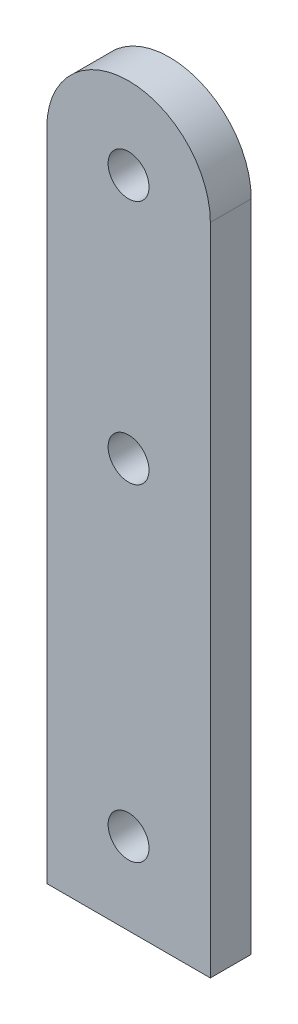
ISO-10303-21;
HEADER;
FILE_DESCRIPTION(('STEP AP214'),'2;1');
FILE_NAME('part.step','',(''),(''),'','','');
FILE_SCHEMA(('AUTOMOTIVE_DESIGN { 1 0 10303 214 1 1 1 1 }'));
ENDSEC;
DATA;
#1=APPLICATION_CONTEXT('core data for automotive mechanical design processes');
#2=APPLICATION_PROTOCOL_DEFINITION('international standard','automotive_design',2000,#1);
#3=PRODUCT_CONTEXT('',#1,'mechanical');
#4=PRODUCT('Part','Part','',(#3));
#5=PRODUCT_RELATED_PRODUCT_CATEGORY('part','',(#4));
#6=PRODUCT_DEFINITION_FORMATION('','',#4);
#7=PRODUCT_DEFINITION_CONTEXT('part definition',#1,'design');
#8=PRODUCT_DEFINITION('design','',#6,#7);
#9=PRODUCT_DEFINITION_SHAPE('','',#8);
#10=(LENGTH_UNIT() NAMED_UNIT(*) SI_UNIT(.MILLI.,.METRE.));
#11=(NAMED_UNIT(*) PLANE_ANGLE_UNIT() SI_UNIT($,.RADIAN.));
#12=(NAMED_UNIT(*) SI_UNIT($,.STERADIAN.) SOLID_ANGLE_UNIT());
#13=UNCERTAINTY_MEASURE_WITH_UNIT(LENGTH_MEASURE(1.E-05),#10,'distance_accuracy_value','');
#14=(GEOMETRIC_REPRESENTATION_CONTEXT(3) GLOBAL_UNCERTAINTY_ASSIGNED_CONTEXT((#13)) GLOBAL_UNIT_ASSIGNED_CONTEXT((#10,
#11,#12)) REPRESENTATION_CONTEXT('',''));
#15=CARTESIAN_POINT('',(0.,0.,0.));
#16=DIRECTION('',(0.,0.,1.));
#17=DIRECTION('',(1.,0.,0.));
#18=AXIS2_PLACEMENT_3D('',#15,#16,#17);
#19=CARTESIAN_POINT('',(12.7,101.6,6.35));
#20=DIRECTION('',(0.,0.,-1.));
#21=DIRECTION('',(-1.,0.,0.));
#22=AXIS2_PLACEMENT_3D('',#19,#20,#21);
#23=PLANE('',#22);
#24=CARTESIAN_POINT('',(12.7,12.7,6.35));
#25=DIRECTION('',(0.,0.,1.));
#26=DIRECTION('',(1.,0.,0.));
#27=AXIS2_PLACEMENT_3D('',#24,#25,#26);
#28=CIRCLE('',#27,3.175);
#29=CARTESIAN_POINT('',(15.875,12.7,6.35));
#30=VERTEX_POINT('',#29);
#31=EDGE_CURVE('E123',#30,#30,#28,.T.);
#32=ORIENTED_EDGE('',*,*,#31,.F.);
#33=EDGE_LOOP('',(#32));
#34=FACE_BOUND('',#33,.T.);
#35=CARTESIAN_POINT('',(12.7,63.5,6.35));
#36=DIRECTION('',(0.,0.,1.));
#37=DIRECTION('',(1.,0.,0.));
#38=AXIS2_PLACEMENT_3D('',#35,#36,#37);
#39=CIRCLE('',#38,3.175);
#40=CARTESIAN_POINT('',(15.875,63.5,6.35));
#41=VERTEX_POINT('',#40);
#42=EDGE_CURVE('E117',#41,#41,#39,.T.);
#43=ORIENTED_EDGE('',*,*,#42,.F.);
#44=EDGE_LOOP('',(#43));
#45=FACE_BOUND('',#44,.T.);
#46=DIRECTION('',(1.,0.,0.));
#47=VECTOR('',#46,1.);
#48=CARTESIAN_POINT('',(25.4,0.,6.35));
#49=LINE('',#48,#47);
#50=CARTESIAN_POINT('',(0.,0.,6.35));
#51=VERTEX_POINT('',#50);
#52=CARTESIAN_POINT('',(25.4,0.,6.35));
#53=VERTEX_POINT('',#52);
#54=EDGE_CURVE('E84',#51,#53,#49,.T.);
#55=ORIENTED_EDGE('',*,*,#54,.T.);
#56=DIRECTION('',(0.,1.,0.));
#57=VECTOR('',#56,1.);
#58=CARTESIAN_POINT('',(25.4,101.6,6.35));
#59=LINE('',#58,#57);
#60=CARTESIAN_POINT('',(25.4,101.6,6.35));
#61=VERTEX_POINT('',#60);
#62=EDGE_CURVE('E79',#53,#61,#59,.T.);
#63=ORIENTED_EDGE('',*,*,#62,.T.);
#64=CARTESIAN_POINT('',(12.7,101.6,6.35));
#65=DIRECTION('',(0.,0.,1.));
#66=DIRECTION('',(-1.,0.,0.));
#67=AXIS2_PLACEMENT_3D('',#64,#65,#66);
#68=CIRCLE('',#67,12.7);
#69=CARTESIAN_POINT('',(0.,101.6,6.35));
#70=VERTEX_POINT('',#69);
#71=EDGE_CURVE('E82',#61,#70,#68,.T.);
#72=ORIENTED_EDGE('',*,*,#71,.T.);
#73=DIRECTION('',(0.,-1.,0.));
#74=VECTOR('',#73,1.);
#75=CARTESIAN_POINT('',(0.,0.,6.35));
#76=LINE('',#75,#74);
#77=EDGE_CURVE('E49',#70,#51,#76,.T.);
#78=ORIENTED_EDGE('',*,*,#77,.T.);
#79=EDGE_LOOP('',(#55,#63,#72,#78));
#80=FACE_BOUND('',#79,.T.);
#81=CARTESIAN_POINT('',(12.7,101.6,6.35));
#82=DIRECTION('',(0.,0.,1.));
#83=DIRECTION('',(1.,0.,0.));
#84=AXIS2_PLACEMENT_3D('',#81,#82,#83);
#85=CIRCLE('',#84,3.175);
#86=CARTESIAN_POINT('',(15.875,101.6,6.35));
#87=VERTEX_POINT('',#86);
#88=EDGE_CURVE('E99',#87,#87,#85,.T.);
#89=ORIENTED_EDGE('',*,*,#88,.F.);
#90=EDGE_LOOP('',(#89));
#91=FACE_BOUND('',#90,.T.);
#92=ADVANCED_FACE('F32',(#34,#45,#80,#91),#23,.F.);
#93=CARTESIAN_POINT('',(12.7,101.6,0.));
#94=DIRECTION('',(0.,0.,-1.));
#95=DIRECTION('',(-1.,0.,0.));
#96=AXIS2_PLACEMENT_3D('',#93,#94,#95);
#97=PLANE('',#96);
#98=CARTESIAN_POINT('',(12.7,12.7,0.));
#99=DIRECTION('',(0.,0.,1.));
#100=DIRECTION('',(1.,0.,0.));
#101=AXIS2_PLACEMENT_3D('',#98,#99,#100);
#102=CIRCLE('',#101,3.175);
#103=CARTESIAN_POINT('',(15.875,12.7,0.));
#104=VERTEX_POINT('',#103);
#105=EDGE_CURVE('E120',#104,#104,#102,.T.);
#106=ORIENTED_EDGE('',*,*,#105,.T.);
#107=EDGE_LOOP('',(#106));
#108=FACE_BOUND('',#107,.T.);
#109=CARTESIAN_POINT('',(12.7,63.5,0.));
#110=DIRECTION('',(0.,0.,1.));
#111=DIRECTION('',(1.,0.,0.));
#112=AXIS2_PLACEMENT_3D('',#109,#110,#111);
#113=CIRCLE('',#112,3.175);
#114=CARTESIAN_POINT('',(15.875,63.5,0.));
#115=VERTEX_POINT('',#114);
#116=EDGE_CURVE('E114',#115,#115,#113,.T.);
#117=ORIENTED_EDGE('',*,*,#116,.T.);
#118=EDGE_LOOP('',(#117));
#119=FACE_BOUND('',#118,.T.);
#120=DIRECTION('',(1.,0.,0.));
#121=VECTOR('',#120,1.);
#122=CARTESIAN_POINT('',(25.4,0.,0.));
#123=LINE('',#122,#121);
#124=CARTESIAN_POINT('',(0.,0.,0.));
#125=VERTEX_POINT('',#124);
#126=CARTESIAN_POINT('',(25.4,0.,0.));
#127=VERTEX_POINT('',#126);
#128=EDGE_CURVE('E96',#125,#127,#123,.T.);
#129=ORIENTED_EDGE('',*,*,#128,.F.);
#130=DIRECTION('',(0.,-1.,0.));
#131=VECTOR('',#130,1.);
#132=CARTESIAN_POINT('',(0.,0.,0.));
#133=LINE('',#132,#131);
#134=CARTESIAN_POINT('',(0.,101.6,0.));
#135=VERTEX_POINT('',#134);
#136=EDGE_CURVE('E72',#135,#125,#133,.T.);
#137=ORIENTED_EDGE('',*,*,#136,.F.);
#138=CARTESIAN_POINT('',(12.7,101.6,0.));
#139=DIRECTION('',(0.,0.,1.));
#140=DIRECTION('',(-1.,0.,0.));
#141=AXIS2_PLACEMENT_3D('',#138,#139,#140);
#142=CIRCLE('',#141,12.7);
#143=CARTESIAN_POINT('',(25.4,101.6,0.));
#144=VERTEX_POINT('',#143);
#145=EDGE_CURVE('E66',#144,#135,#142,.T.);
#146=ORIENTED_EDGE('',*,*,#145,.F.);
#147=DIRECTION('',(0.,1.,0.));
#148=VECTOR('',#147,1.);
#149=CARTESIAN_POINT('',(25.4,101.6,0.));
#150=LINE('',#149,#148);
#151=EDGE_CURVE('E88',#127,#144,#150,.T.);
#152=ORIENTED_EDGE('',*,*,#151,.F.);
#153=EDGE_LOOP('',(#129,#137,#146,#152));
#154=FACE_BOUND('',#153,.T.);
#155=CARTESIAN_POINT('',(12.7,101.6,0.));
#156=DIRECTION('',(0.,0.,1.));
#157=DIRECTION('',(1.,0.,0.));
#158=AXIS2_PLACEMENT_3D('',#155,#156,#157);
#159=CIRCLE('',#158,3.175);
#160=CARTESIAN_POINT('',(15.875,101.6,0.));
#161=VERTEX_POINT('',#160);
#162=EDGE_CURVE('E111',#161,#161,#159,.T.);
#163=ORIENTED_EDGE('',*,*,#162,.T.);
#164=EDGE_LOOP('',(#163));
#165=FACE_BOUND('',#164,.T.);
#166=ADVANCED_FACE('F107',(#108,#119,#154,#165),#97,.T.);
#167=CARTESIAN_POINT('',(25.4,0.,6.35));
#168=DIRECTION('',(0.,1.,0.));
#169=DIRECTION('',(-1.,0.,0.));
#170=AXIS2_PLACEMENT_3D('',#167,#168,#169);
#171=PLANE('',#170);
#172=ORIENTED_EDGE('',*,*,#128,.T.);
#173=DIRECTION('',(0.,0.,-1.));
#174=VECTOR('',#173,1.);
#175=CARTESIAN_POINT('',(25.4,0.,6.35));
#176=LINE('',#175,#174);
#177=EDGE_CURVE('E11',#53,#127,#176,.T.);
#178=ORIENTED_EDGE('',*,*,#177,.F.);
#179=ORIENTED_EDGE('',*,*,#54,.F.);
#180=DIRECTION('',(0.,0.,-1.));
#181=VECTOR('',#180,1.);
#182=CARTESIAN_POINT('',(0.,0.,6.35));
#183=LINE('',#182,#181);
#184=EDGE_CURVE('E92',#51,#125,#183,.T.);
#185=ORIENTED_EDGE('',*,*,#184,.T.);
#186=EDGE_LOOP('',(#172,#178,#179,#185));
#187=FACE_BOUND('',#186,.T.);
#188=ADVANCED_FACE('F34',(#187),#171,.F.);
#189=CARTESIAN_POINT('',(25.4,101.6,6.35));
#190=DIRECTION('',(-1.,0.,0.));
#191=DIRECTION('',(0.,-1.,0.));
#192=AXIS2_PLACEMENT_3D('',#189,#190,#191);
#193=PLANE('',#192);
#194=ORIENTED_EDGE('',*,*,#151,.T.);
#195=DIRECTION('',(0.,0.,-1.));
#196=VECTOR('',#195,1.);
#197=CARTESIAN_POINT('',(25.4,101.6,6.35));
#198=LINE('',#197,#196);
#199=EDGE_CURVE('E41',#61,#144,#198,.T.);
#200=ORIENTED_EDGE('',*,*,#199,.F.);
#201=ORIENTED_EDGE('',*,*,#62,.F.);
#202=ORIENTED_EDGE('',*,*,#177,.T.);
#203=EDGE_LOOP('',(#194,#200,#201,#202));
#204=FACE_BOUND('',#203,.T.);
#205=ADVANCED_FACE('F87',(#204),#193,.F.);
#206=CARTESIAN_POINT('',(12.7,101.6,6.35));
#207=DIRECTION('',(0.,0.,-1.));
#208=DIRECTION('',(-1.,0.,0.));
#209=AXIS2_PLACEMENT_3D('',#206,#207,#208);
#210=CYLINDRICAL_SURFACE('',#209,12.7);
#211=ORIENTED_EDGE('',*,*,#145,.T.);
#212=DIRECTION('',(0.,0.,-1.));
#213=VECTOR('',#212,1.);
#214=CARTESIAN_POINT('',(0.,101.6,6.35));
#215=LINE('',#214,#213);
#216=EDGE_CURVE('E89',#70,#135,#215,.T.);
#217=ORIENTED_EDGE('',*,*,#216,.F.);
#218=ORIENTED_EDGE('',*,*,#71,.F.);
#219=ORIENTED_EDGE('',*,*,#199,.T.);
#220=EDGE_LOOP('',(#211,#217,#218,#219));
#221=FACE_BOUND('',#220,.T.);
#222=ADVANCED_FACE('F90',(#221),#210,.T.);
#223=CARTESIAN_POINT('',(0.,0.,6.35));
#224=DIRECTION('',(1.,0.,0.));
#225=DIRECTION('',(0.,0.,-1.));
#226=AXIS2_PLACEMENT_3D('',#223,#224,#225);
#227=PLANE('',#226);
#228=ORIENTED_EDGE('',*,*,#136,.T.);
#229=ORIENTED_EDGE('',*,*,#184,.F.);
#230=ORIENTED_EDGE('',*,*,#77,.F.);
#231=ORIENTED_EDGE('',*,*,#216,.T.);
#232=EDGE_LOOP('',(#228,#229,#230,#231));
#233=FACE_BOUND('',#232,.T.);
#234=ADVANCED_FACE('F104',(#233),#227,.F.);
#235=CARTESIAN_POINT('',(12.7,101.6,6.35));
#236=DIRECTION('',(0.,0.,-1.));
#237=DIRECTION('',(-1.,0.,0.));
#238=AXIS2_PLACEMENT_3D('',#235,#236,#237);
#239=CYLINDRICAL_SURFACE('',#238,3.175);
#240=ORIENTED_EDGE('',*,*,#88,.T.);
#241=EDGE_LOOP('',(#240));
#242=FACE_BOUND('',#241,.T.);
#243=ORIENTED_EDGE('',*,*,#162,.F.);
#244=EDGE_LOOP('',(#243));
#245=FACE_BOUND('',#244,.T.);
#246=ADVANCED_FACE('F144',(#242,#245),#239,.F.);
#247=CARTESIAN_POINT('',(12.7,63.5,0.));
#248=DIRECTION('',(0.,0.,1.));
#249=DIRECTION('',(1.,0.,0.));
#250=AXIS2_PLACEMENT_3D('',#247,#248,#249);
#251=CYLINDRICAL_SURFACE('',#250,3.175);
#252=ORIENTED_EDGE('',*,*,#116,.F.);
#253=EDGE_LOOP('',(#252));
#254=FACE_BOUND('',#253,.T.);
#255=ORIENTED_EDGE('',*,*,#42,.T.);
#256=EDGE_LOOP('',(#255));
#257=FACE_BOUND('',#256,.T.);
#258=ADVANCED_FACE('F134',(#254,#257),#251,.F.);
#259=CARTESIAN_POINT('',(12.7,12.7,0.));
#260=DIRECTION('',(0.,0.,1.));
#261=DIRECTION('',(1.,0.,0.));
#262=AXIS2_PLACEMENT_3D('',#259,#260,#261);
#263=CYLINDRICAL_SURFACE('',#262,3.175);
#264=ORIENTED_EDGE('',*,*,#105,.F.);
#265=EDGE_LOOP('',(#264));
#266=FACE_BOUND('',#265,.T.);
#267=ORIENTED_EDGE('',*,*,#31,.T.);
#268=EDGE_LOOP('',(#267));
#269=FACE_BOUND('',#268,.T.);
#270=ADVANCED_FACE('F131',(#266,#269),#263,.F.);
#271=CLOSED_SHELL('',(#92,#166,#188,#205,#222,#234,#246,#258,#270));
#272=MANIFOLD_SOLID_BREP('B2',#271);
#273=ADVANCED_BREP_SHAPE_REPRESENTATION('',(#18,#272),#14);
#274=SHAPE_DEFINITION_REPRESENTATION(#9,#273);
ENDSEC;
END-ISO-10303-21;
